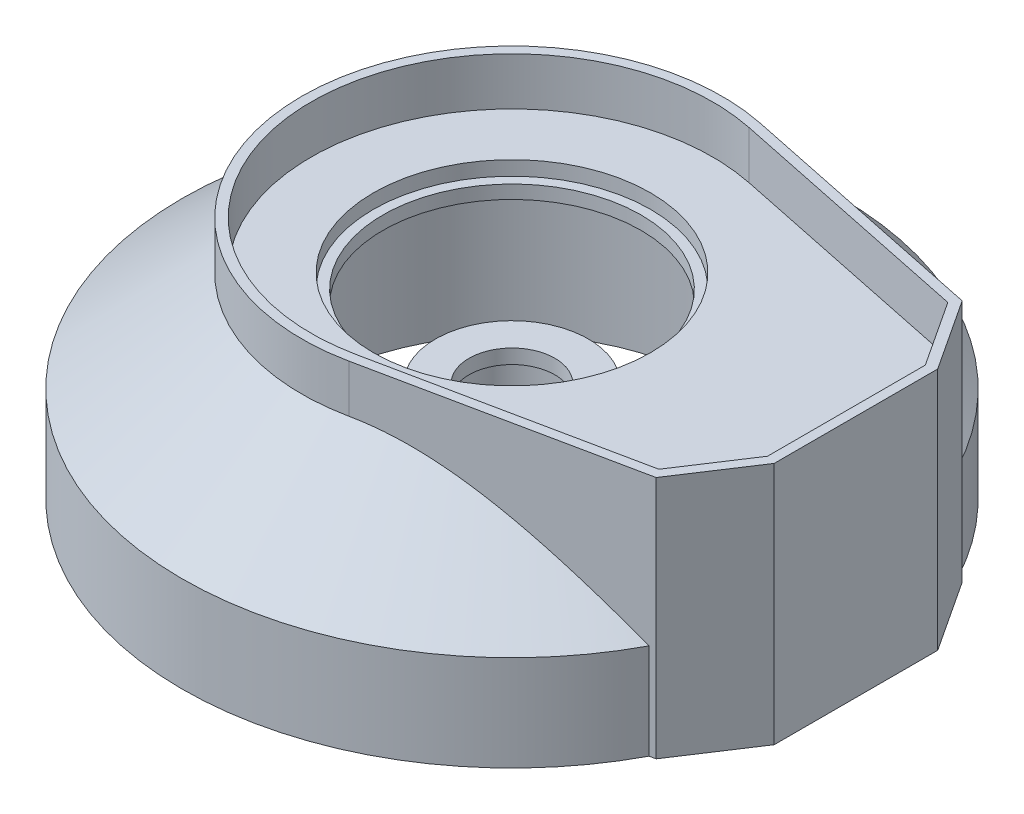
ISO-10303-21;
HEADER;
FILE_DESCRIPTION(('STEP AP214'),'2;1');
FILE_NAME('part.step','',(''),(''),'','','');
FILE_SCHEMA(('AUTOMOTIVE_DESIGN { 1 0 10303 214 1 1 1 1 }'));
ENDSEC;
DATA;
#1=APPLICATION_CONTEXT('core data for automotive mechanical design processes');
#2=APPLICATION_PROTOCOL_DEFINITION('international standard','automotive_design',2000,#1);
#3=PRODUCT_CONTEXT('',#1,'mechanical');
#4=PRODUCT('Part','Part','',(#3));
#5=PRODUCT_RELATED_PRODUCT_CATEGORY('part','',(#4));
#6=PRODUCT_DEFINITION_FORMATION('','',#4);
#7=PRODUCT_DEFINITION_CONTEXT('part definition',#1,'design');
#8=PRODUCT_DEFINITION('design','',#6,#7);
#9=PRODUCT_DEFINITION_SHAPE('','',#8);
#10=(LENGTH_UNIT() NAMED_UNIT(*) SI_UNIT(.MILLI.,.METRE.));
#11=(NAMED_UNIT(*) PLANE_ANGLE_UNIT() SI_UNIT($,.RADIAN.));
#12=(NAMED_UNIT(*) SI_UNIT($,.STERADIAN.) SOLID_ANGLE_UNIT());
#13=UNCERTAINTY_MEASURE_WITH_UNIT(LENGTH_MEASURE(1.E-05),#10,'distance_accuracy_value','');
#14=(GEOMETRIC_REPRESENTATION_CONTEXT(3) GLOBAL_UNCERTAINTY_ASSIGNED_CONTEXT((#13)) GLOBAL_UNIT_ASSIGNED_CONTEXT((#10,
#11,#12)) REPRESENTATION_CONTEXT('',''));
#15=CARTESIAN_POINT('',(0.,0.,0.));
#16=DIRECTION('',(0.,0.,1.));
#17=DIRECTION('',(1.,0.,0.));
#18=AXIS2_PLACEMENT_3D('',#15,#16,#17);
#19=CARTESIAN_POINT('',(0.,-110.40219778561,0.));
#20=DIRECTION('',(0.,1.,0.));
#21=DIRECTION('',(0.,0.,1.));
#22=AXIS2_PLACEMENT_3D('',#19,#20,#21);
#23=CYLINDRICAL_SURFACE('',#22,44.);
#24=CARTESIAN_POINT('',(0.,41.,0.));
#25=DIRECTION('',(0.,-1.,0.));
#26=DIRECTION('',(0.,0.,-1.));
#27=AXIS2_PLACEMENT_3D('',#24,#25,#26);
#28=CIRCLE('',#27,44.);
#29=CARTESIAN_POINT('',(8.93777798271002,41.,43.0826661748294));
#30=VERTEX_POINT('',#29);
#31=CARTESIAN_POINT('',(8.93777798271,41.,-43.0826661748294));
#32=VERTEX_POINT('',#31);
#33=EDGE_CURVE('E265',#30,#32,#28,.T.);
#34=ORIENTED_EDGE('',*,*,#33,.F.);
#35=DIRECTION('',(0.,1.,0.));
#36=VECTOR('',#35,1.);
#37=CARTESIAN_POINT('',(8.93777798271,-110.40219778561,43.0826661748294));
#38=LINE('',#37,#36);
#39=CARTESIAN_POINT('',(8.93777798271,51.,43.0826661748294));
#40=VERTEX_POINT('',#39);
#41=EDGE_CURVE('E408',#30,#40,#38,.T.);
#42=ORIENTED_EDGE('',*,*,#41,.T.);
#43=CARTESIAN_POINT('',(0.,51.,0.));
#44=DIRECTION('',(0.,1.,0.));
#45=DIRECTION('',(0.,0.,1.));
#46=AXIS2_PLACEMENT_3D('',#43,#44,#45);
#47=CIRCLE('',#46,44.);
#48=CARTESIAN_POINT('',(8.93777798271,51.,-43.0826661748294));
#49=VERTEX_POINT('',#48);
#50=EDGE_CURVE('E302',#40,#49,#47,.F.);
#51=ORIENTED_EDGE('',*,*,#50,.T.);
#52=DIRECTION('',(0.,1.,0.));
#53=VECTOR('',#52,1.);
#54=CARTESIAN_POINT('',(8.93777798271,-110.40219778561,-43.0826661748294));
#55=LINE('',#54,#53);
#56=EDGE_CURVE('E410',#32,#49,#55,.T.);
#57=ORIENTED_EDGE('',*,*,#56,.F.);
#58=EDGE_LOOP('',(#34,#42,#51,#57));
#59=FACE_BOUND('',#58,.T.);
#60=ADVANCED_FACE('F121',(#59),#23,.T.);
#61=CARTESIAN_POINT('',(8.93777798271002,-110.40219778561,-43.0826661748294));
#62=DIRECTION('',(-0.203131317788864,0.,0.979151503973394));
#63=DIRECTION('',(0.979151503973394,0.,0.203131317788864));
#64=AXIS2_PLACEMENT_3D('',#61,#62,#63);
#65=PLANE('',#64);
#66=DIRECTION('',(0.,1.,0.));
#67=VECTOR('',#66,1.);
#68=CARTESIAN_POINT('',(60.9803942826881,0.,-32.2860885386865));
#69=LINE('',#68,#67);
#70=CARTESIAN_POINT('',(60.9803942826881,20.,-32.2860885386865));
#71=VERTEX_POINT('',#70);
#72=CARTESIAN_POINT('',(60.9803942826881,0.,-32.2860885386865));
#73=VERTEX_POINT('',#72);
#74=EDGE_CURVE('E137',#71,#73,#69,.F.);
#75=ORIENTED_EDGE('',*,*,#74,.F.);
#76=CARTESIAN_POINT('',(8.93757798271,40.9999999996018,-43.082707666124));
#77=CARTESIAN_POINT('',(9.32519622075362,41.0000059490868,-43.0022937534932));
#78=CARTESIAN_POINT('',(9.71280075916332,40.9955146155934,-42.9218826829402));
#79=CARTESIAN_POINT('',(10.4878066764746,40.9775791489886,-42.7611026885892));
#80=CARTESIAN_POINT('',(10.8752080577615,40.9641351234574,-42.6807337642964));
#81=CARTESIAN_POINT('',(12.036671794259,40.9104450928385,-42.4397805937183));
#82=CARTESIAN_POINT('',(12.8101801104704,40.8568410954801,-42.2793112864098));
#83=CARTESIAN_POINT('',(14.3524813138459,40.7150327815944,-41.9593509180729));
#84=CARTESIAN_POINT('',(15.1212806667881,40.6269007632576,-41.7998585156769));
#85=CARTESIAN_POINT('',(16.6545462287375,40.4174137881808,-41.4817726496437));
#86=CARTESIAN_POINT('',(17.4190122690688,40.2960575471161,-41.3231792209994));
#87=CARTESIAN_POINT('',(18.9310839368563,40.0239526460462,-41.0094901655034));
#88=CARTESIAN_POINT('',(19.6787706114178,39.8736713823153,-40.8543777249051));
#89=CARTESIAN_POINT('',(21.1680592439082,39.5445545454136,-40.5454151575617));
#90=CARTESIAN_POINT('',(21.9096612932241,39.3657194019315,-40.3915650118579));
#91=CARTESIAN_POINT('',(23.3864814446187,38.9815267320164,-40.0851891116294));
#92=CARTESIAN_POINT('',(24.1216974442409,38.7761607996912,-39.9326637932729));
#93=CARTESIAN_POINT('',(25.5851789464068,38.3410906606276,-39.6290550821713));
#94=CARTESIAN_POINT('',(26.3134442160534,38.1113856414615,-39.4779717377421));
#95=CARTESIAN_POINT('',(28.5290726343952,37.3751636284771,-39.018325280047));
#96=CARTESIAN_POINT('',(30.0050673014767,36.8327158286681,-38.7121206318828));
#97=CARTESIAN_POINT('',(32.9278052979048,35.6708589924042,-38.1057797149187));
#98=CARTESIAN_POINT('',(34.3745395754193,35.0514265513548,-37.8056453239799));
#99=CARTESIAN_POINT('',(37.2438754939052,33.7487807213137,-37.2103830137697));
#100=CARTESIAN_POINT('',(38.6664168784914,33.0654296872934,-36.9152675950755));
#101=CARTESIAN_POINT('',(41.4867738479143,31.6481007403202,-36.3301662849013));
#102=CARTESIAN_POINT('',(42.8845919935008,30.914128109623,-36.0401798621772));
#103=CARTESIAN_POINT('',(45.7067297279306,29.3788167969965,-35.454709120775));
#104=CARTESIAN_POINT('',(47.1302881341459,28.5760248230066,-35.1593827143604));
#105=CARTESIAN_POINT('',(49.9575086945688,26.9345421694061,-34.5728575078035));
#106=CARTESIAN_POINT('',(51.361169239332,26.0958486076916,-34.2816590415509));
#107=CARTESIAN_POINT('',(53.4493988324946,24.8183996073651,-33.8484422948233));
#108=CARTESIAN_POINT('',(54.1404884953468,24.3907002699373,-33.7050712706704));
#109=CARTESIAN_POINT('',(55.5187075989268,23.5286848431977,-33.41915079608));
#110=CARTESIAN_POINT('',(56.2058370220628,23.0943687245245,-33.2766013492919));
#111=CARTESIAN_POINT('',(57.5762365710655,22.2198358869676,-32.9923030919165));
#112=CARTESIAN_POINT('',(58.2595076438891,21.7796207141004,-32.8505540848768));
#113=CARTESIAN_POINT('',(59.6226127323629,20.8937010687634,-32.5677691105569));
#114=CARTESIAN_POINT('',(60.302446810579,20.4479966967283,-32.4267331302971));
#115=CARTESIAN_POINT('',(60.9806969321848,19.9998,-32.2860257520893));
#116=B_SPLINE_CURVE_WITH_KNOTS('',3,(#76,#77,#78,#79,#80,#81,#82,#83,#84,#85,#86,#87,#88,#89,
#90,#91,#92,#93,#94,#95,#96,#97,#98,#99,#100,#101,#102,#103,#104,#105,#106,#107,#108,#109,#110,
#111,#112,#113,#114,#115),.UNSPECIFIED.,.F.,.F.,(4,2,2,2,2,2,2,2,2,2,2,2,2,2,2,2,2,2,2,4),(0.,
1.18756155072871,2.37510883133959,4.74963291183058,7.11921132615951,9.48888135250073,
11.8230633755557,14.157210276338,16.492098539503,18.8270647647401,23.6303334864867,
28.4350660693155,33.2503946406428,38.06522150071,43.04696458381,48.0291083435452,
50.5049199642025,52.9807425742829,55.4559285437489,57.9310692923475),.UNSPECIFIED.);
#117=EDGE_CURVE('E268',#32,#71,#116,.T.);
#118=ORIENTED_EDGE('',*,*,#117,.F.);
#119=ORIENTED_EDGE('',*,*,#56,.T.);
#120=DIRECTION('',(0.979151503973394,0.,0.203131317788864));
#121=VECTOR('',#120,1.);
#122=CARTESIAN_POINT('',(8.93777798271,51.,-43.0826661748294));
#123=LINE('',#122,#121);
#124=CARTESIAN_POINT('',(62.208484960266,51.,-32.0313131778886));
#125=VERTEX_POINT('',#124);
#126=EDGE_CURVE('E303',#49,#125,#123,.T.);
#127=ORIENTED_EDGE('',*,*,#126,.T.);
#128=DIRECTION('',(0.,-1.,0.));
#129=VECTOR('',#128,1.);
#130=CARTESIAN_POINT('',(62.208484960266,-110.40219778561,-32.0313131778886));
#131=LINE('',#130,#129);
#132=CARTESIAN_POINT('',(62.208484960266,0.,-32.0313131778886));
#133=VERTEX_POINT('',#132);
#134=EDGE_CURVE('E428',#125,#133,#131,.T.);
#135=ORIENTED_EDGE('',*,*,#134,.T.);
#136=DIRECTION('',(0.979151503973394,0.,0.203131317788864));
#137=VECTOR('',#136,1.);
#138=CARTESIAN_POINT('',(8.93777798271,0.,-43.0826661748294));
#139=LINE('',#138,#137);
#140=EDGE_CURVE('E277',#73,#133,#139,.T.);
#141=ORIENTED_EDGE('',*,*,#140,.F.);
#142=EDGE_LOOP('',(#75,#118,#119,#127,#135,#141));
#143=FACE_BOUND('',#142,.T.);
#144=ADVANCED_FACE('F275',(#143),#65,.F.);
#145=CARTESIAN_POINT('',(8.93777798271002,-110.40219778561,43.0826661748294));
#146=DIRECTION('',(-0.203131317788864,0.,-0.979151503973394));
#147=DIRECTION('',(-0.979151503973394,0.,0.203131317788864));
#148=AXIS2_PLACEMENT_3D('',#145,#146,#147);
#149=PLANE('',#148);
#150=DIRECTION('',(0.,-1.,0.));
#151=VECTOR('',#150,1.);
#152=CARTESIAN_POINT('',(60.9803942826881,0.,32.2860885386865));
#153=LINE('',#152,#151);
#154=CARTESIAN_POINT('',(60.9803942826881,20.,32.2860885386865));
#155=VERTEX_POINT('',#154);
#156=CARTESIAN_POINT('',(60.9803942826881,0.,32.2860885386866));
#157=VERTEX_POINT('',#156);
#158=EDGE_CURVE('E261',#155,#157,#153,.T.);
#159=ORIENTED_EDGE('',*,*,#158,.T.);
#160=DIRECTION('',(-0.979151503973394,0.,0.203131317788864));
#161=VECTOR('',#160,1.);
#162=CARTESIAN_POINT('',(62.208484960266,0.,32.0313131778886));
#163=LINE('',#162,#161);
#164=CARTESIAN_POINT('',(62.208484960266,0.,32.0313131778886));
#165=VERTEX_POINT('',#164);
#166=EDGE_CURVE('E353',#165,#157,#163,.T.);
#167=ORIENTED_EDGE('',*,*,#166,.F.);
#168=DIRECTION('',(0.,1.,0.));
#169=VECTOR('',#168,1.);
#170=CARTESIAN_POINT('',(62.208484960266,-110.40219778561,32.0313131778886));
#171=LINE('',#170,#169);
#172=CARTESIAN_POINT('',(62.208484960266,51.,32.0313131778887));
#173=VERTEX_POINT('',#172);
#174=EDGE_CURVE('E430',#165,#173,#171,.T.);
#175=ORIENTED_EDGE('',*,*,#174,.T.);
#176=DIRECTION('',(-0.979151503973394,0.,0.203131317788864));
#177=VECTOR('',#176,1.);
#178=CARTESIAN_POINT('',(62.208484960266,51.,32.0313131778886));
#179=LINE('',#178,#177);
#180=EDGE_CURVE('E326',#173,#40,#179,.T.);
#181=ORIENTED_EDGE('',*,*,#180,.T.);
#182=ORIENTED_EDGE('',*,*,#41,.F.);
#183=CARTESIAN_POINT('',(8.93757798271,40.9999999996017,43.082707666124));
#184=CARTESIAN_POINT('',(9.32519622075362,41.0000059490868,43.0022937534933));
#185=CARTESIAN_POINT('',(9.71280075916332,40.9955146155934,42.9218826829402));
#186=CARTESIAN_POINT('',(10.4878066764746,40.9775791489886,42.7611026885892));
#187=CARTESIAN_POINT('',(10.8752080577615,40.9641351234574,42.6807337642964));
#188=CARTESIAN_POINT('',(12.036671794259,40.9104450928385,42.4397805937183));
#189=CARTESIAN_POINT('',(12.8101801104704,40.8568410954801,42.2793112864098));
#190=CARTESIAN_POINT('',(14.3524813138459,40.7150327815944,41.9593509180729));
#191=CARTESIAN_POINT('',(15.1212806667881,40.6269007632576,41.7998585156769));
#192=CARTESIAN_POINT('',(16.6545462287375,40.4174137881808,41.4817726496437));
#193=CARTESIAN_POINT('',(17.4190122690688,40.2960575471161,41.3231792209994));
#194=CARTESIAN_POINT('',(18.9310839368563,40.0239526460462,41.0094901655034));
#195=CARTESIAN_POINT('',(19.6787706114178,39.8736713823153,40.8543777249051));
#196=CARTESIAN_POINT('',(21.1680592439082,39.5445545454136,40.5454151575617));
#197=CARTESIAN_POINT('',(21.9096612932241,39.3657194019315,40.3915650118579));
#198=CARTESIAN_POINT('',(23.3864814446187,38.9815267320164,40.0851891116294));
#199=CARTESIAN_POINT('',(24.1216974442409,38.7761607996912,39.932663793273));
#200=CARTESIAN_POINT('',(25.5851789464068,38.3410906606276,39.6290550821713));
#201=CARTESIAN_POINT('',(26.3134442160534,38.1113856414615,39.4779717377421));
#202=CARTESIAN_POINT('',(28.5290726343952,37.3751636284771,39.018325280047));
#203=CARTESIAN_POINT('',(30.0050673014767,36.8327158286681,38.7121206318828));
#204=CARTESIAN_POINT('',(32.9278052979048,35.6708589924042,38.1057797149187));
#205=CARTESIAN_POINT('',(34.3745395754193,35.0514265513548,37.8056453239799));
#206=CARTESIAN_POINT('',(37.2438754939052,33.7487807213137,37.2103830137697));
#207=CARTESIAN_POINT('',(38.6664168784914,33.0654296872934,36.9152675950755));
#208=CARTESIAN_POINT('',(41.4867738479143,31.6481007403202,36.3301662849013));
#209=CARTESIAN_POINT('',(42.8845919935008,30.914128109623,36.0401798621772));
#210=CARTESIAN_POINT('',(45.7067297279305,29.3788167969965,35.454709120775));
#211=CARTESIAN_POINT('',(47.1302881341459,28.5760248230066,35.1593827143604));
#212=CARTESIAN_POINT('',(49.9575086945688,26.9345421694061,34.5728575078035));
#213=CARTESIAN_POINT('',(51.3611692393319,26.0958486076916,34.2816590415509));
#214=CARTESIAN_POINT('',(53.4493988324945,24.8183996073651,33.8484422948233));
#215=CARTESIAN_POINT('',(54.1404884953467,24.3907002699373,33.7050712706705));
#216=CARTESIAN_POINT('',(55.5187075989268,23.5286848431977,33.41915079608));
#217=CARTESIAN_POINT('',(56.2058370220628,23.0943687245245,33.276601349292));
#218=CARTESIAN_POINT('',(57.5762365710655,22.2198358869676,32.9923030919165));
#219=CARTESIAN_POINT('',(58.259507643889,21.7796207141004,32.8505540848768));
#220=CARTESIAN_POINT('',(59.6226127323628,20.8937010687634,32.5677691105569));
#221=CARTESIAN_POINT('',(60.302446810579,20.4479966967283,32.4267331302971));
#222=CARTESIAN_POINT('',(60.9806969321848,19.9998,32.2860257520893));
#223=B_SPLINE_CURVE_WITH_KNOTS('',3,(#183,#184,#185,#186,#187,#188,#189,#190,#191,#192,#193,
#194,#195,#196,#197,#198,#199,#200,#201,#202,#203,#204,#205,#206,#207,#208,#209,#210,#211,#212,
#213,#214,#215,#216,#217,#218,#219,#220,#221,#222),.UNSPECIFIED.,.F.,.F.,(4,2,2,2,2,2,2,2,2,2,2,
2,2,2,2,2,2,2,2,4),(0.,1.18756155072872,2.3751088313396,4.74963291183059,7.11921132615952,
9.48888135250073,11.8230633755557,14.157210276338,16.492098539503,18.8270647647402,
23.6303334864867,28.4350660693155,33.2503946406428,38.06522150071,43.04696458381,
48.0291083435452,50.5049199642025,52.9807425742829,55.4559285437489,57.9310692923475),.UNSPECIFIED.);
#224=EDGE_CURVE('E295',#30,#155,#223,.T.);
#225=ORIENTED_EDGE('',*,*,#224,.T.);
#226=EDGE_LOOP('',(#159,#167,#175,#181,#182,#225));
#227=FACE_BOUND('',#226,.T.);
#228=ADVANCED_FACE('F494',(#227),#149,.F.);
#229=CARTESIAN_POINT('',(-27.,35.2,0.));
#230=DIRECTION('',(0.,-1.,0.));
#231=DIRECTION('',(0.,0.,-1.));
#232=AXIS2_PLACEMENT_3D('',#229,#230,#231);
#233=PLANE('',#232);
#234=CARTESIAN_POINT('',(0.,35.2,0.));
#235=DIRECTION('',(0.,1.,0.));
#236=DIRECTION('',(0.,0.,1.));
#237=AXIS2_PLACEMENT_3D('',#234,#235,#236);
#238=CIRCLE('',#237,27.);
#239=CARTESIAN_POINT('',(0.,35.2,27.));
#240=VERTEX_POINT('',#239);
#241=EDGE_CURVE('E412',#240,#240,#238,.T.);
#242=ORIENTED_EDGE('',*,*,#241,.T.);
#243=EDGE_LOOP('',(#242));
#244=FACE_BOUND('',#243,.T.);
#245=DIRECTION('',(0.979151503973394,0.,-0.203131317788864));
#246=VECTOR('',#245,1.);
#247=CARTESIAN_POINT('',(-17.3544016816684,35.2,46.4945642204433));
#248=LINE('',#247,#246);
#249=CARTESIAN_POINT('',(8.53151534713226,35.2,41.1243631668826));
#250=VERTEX_POINT('',#249);
#251=CARTESIAN_POINT('',(60.9910666595607,35.2,30.2412896634836));
#252=VERTEX_POINT('',#251);
#253=EDGE_CURVE('E406',#250,#252,#248,.T.);
#254=ORIENTED_EDGE('',*,*,#253,.F.);
#255=CARTESIAN_POINT('',(0.,35.2,0.));
#256=DIRECTION('',(0.,-1.,0.));
#257=DIRECTION('',(0.,0.,-1.));
#258=AXIS2_PLACEMENT_3D('',#255,#256,#257);
#259=CIRCLE('',#258,42.);
#260=CARTESIAN_POINT('',(8.53151534713227,35.2,-41.1243631668826));
#261=VERTEX_POINT('',#260);
#262=EDGE_CURVE('E393',#261,#250,#259,.F.);
#263=ORIENTED_EDGE('',*,*,#262,.F.);
#264=DIRECTION('',(-0.979151503973394,0.,-0.203131317788864));
#265=VECTOR('',#264,1.);
#266=CARTESIAN_POINT('',(-17.3544016816684,35.2,-46.4945642204433));
#267=LINE('',#266,#265);
#268=CARTESIAN_POINT('',(60.9910666595607,35.2,-30.2412896634836));
#269=VERTEX_POINT('',#268);
#270=EDGE_CURVE('E396',#269,#261,#267,.T.);
#271=ORIENTED_EDGE('',*,*,#270,.F.);
#272=DIRECTION('',(-0.54872913598873,0.,-0.836000200548458));
#273=VECTOR('',#272,1.);
#274=CARTESIAN_POINT('',(48.3694527184818,35.2,-49.4705798431907));
#275=LINE('',#274,#273);
#276=CARTESIAN_POINT('',(70.,35.2,-16.5159931822528));
#277=VERTEX_POINT('',#276);
#278=EDGE_CURVE('E399',#277,#269,#275,.T.);
#279=ORIENTED_EDGE('',*,*,#278,.F.);
#280=DIRECTION('',(0.,0.,-1.));
#281=VECTOR('',#280,1.);
#282=CARTESIAN_POINT('',(70.,35.2,0.));
#283=LINE('',#282,#281);
#284=CARTESIAN_POINT('',(70.,35.2,16.5159931822528));
#285=VERTEX_POINT('',#284);
#286=EDGE_CURVE('E402',#285,#277,#283,.T.);
#287=ORIENTED_EDGE('',*,*,#286,.F.);
#288=DIRECTION('',(0.54872913598873,0.,-0.836000200548458));
#289=VECTOR('',#288,1.);
#290=CARTESIAN_POINT('',(48.3694527184818,35.2,49.4705798431907));
#291=LINE('',#290,#289);
#292=EDGE_CURVE('E145',#252,#285,#291,.T.);
#293=ORIENTED_EDGE('',*,*,#292,.F.);
#294=EDGE_LOOP('',(#254,#263,#271,#279,#287,#293));
#295=FACE_BOUND('',#294,.T.);
#296=ADVANCED_FACE('F499',(#244,#295),#233,.T.);
#297=CARTESIAN_POINT('',(-32.,41.,0.));
#298=DIRECTION('',(0.,1.,0.));
#299=DIRECTION('',(0.,0.,1.));
#300=AXIS2_PLACEMENT_3D('',#297,#298,#299);
#301=PLANE('',#300);
#302=CARTESIAN_POINT('',(0.,41.,0.));
#303=DIRECTION('',(0.,1.,0.));
#304=DIRECTION('',(0.,0.,1.));
#305=AXIS2_PLACEMENT_3D('',#302,#303,#304);
#306=CIRCLE('',#305,29.);
#307=CARTESIAN_POINT('',(0.,41.,29.));
#308=VERTEX_POINT('',#307);
#309=EDGE_CURVE('E421',#308,#308,#306,.T.);
#310=ORIENTED_EDGE('',*,*,#309,.F.);
#311=EDGE_LOOP('',(#310));
#312=FACE_BOUND('',#311,.T.);
#313=DIRECTION('',(-0.979151503973394,0.,0.203131317788864));
#314=VECTOR('',#313,1.);
#315=CARTESIAN_POINT('',(-22.1480900203352,41.,47.4890458970286));
#316=LINE('',#315,#314);
#317=CARTESIAN_POINT('',(60.9910666595607,41.,30.2412896634836));
#318=VERTEX_POINT('',#317);
#319=CARTESIAN_POINT('',(8.53151534713225,41.,41.1243631668826));
#320=VERTEX_POINT('',#319);
#321=EDGE_CURVE('E14',#318,#320,#316,.T.);
#322=ORIENTED_EDGE('',*,*,#321,.F.);
#323=DIRECTION('',(-0.54872913598873,0.,0.836000200548458));
#324=VECTOR('',#323,1.);
#325=CARTESIAN_POINT('',(46.8639343950671,41.,51.7642681818575));
#326=LINE('',#325,#324);
#327=CARTESIAN_POINT('',(70.,41.,16.5159931822528));
#328=VERTEX_POINT('',#327);
#329=EDGE_CURVE('E130',#328,#318,#326,.T.);
#330=ORIENTED_EDGE('',*,*,#329,.F.);
#331=DIRECTION('',(0.,0.,1.));
#332=VECTOR('',#331,1.);
#333=CARTESIAN_POINT('',(70.,41.,0.));
#334=LINE('',#333,#332);
#335=CARTESIAN_POINT('',(70.,41.,-16.5159931822528));
#336=VERTEX_POINT('',#335);
#337=EDGE_CURVE('E441',#336,#328,#334,.T.);
#338=ORIENTED_EDGE('',*,*,#337,.F.);
#339=DIRECTION('',(0.54872913598873,0.,0.836000200548458));
#340=VECTOR('',#339,1.);
#341=CARTESIAN_POINT('',(46.8639343950671,41.,-51.7642681818575));
#342=LINE('',#341,#340);
#343=CARTESIAN_POINT('',(60.9910666595607,41.,-30.2412896634836));
#344=VERTEX_POINT('',#343);
#345=EDGE_CURVE('E438',#344,#336,#342,.T.);
#346=ORIENTED_EDGE('',*,*,#345,.F.);
#347=DIRECTION('',(0.979151503973394,0.,0.203131317788864));
#348=VECTOR('',#347,1.);
#349=CARTESIAN_POINT('',(-22.1480900203352,41.,-47.4890458970286));
#350=LINE('',#349,#348);
#351=CARTESIAN_POINT('',(8.53151534713227,41.,-41.1243631668826));
#352=VERTEX_POINT('',#351);
#353=EDGE_CURVE('E435',#352,#344,#350,.T.);
#354=ORIENTED_EDGE('',*,*,#353,.F.);
#355=CARTESIAN_POINT('',(0.,41.,0.));
#356=DIRECTION('',(0.,1.,0.));
#357=DIRECTION('',(0.,0.,1.));
#358=AXIS2_PLACEMENT_3D('',#355,#356,#357);
#359=CIRCLE('',#358,42.);
#360=EDGE_CURVE('E432',#320,#352,#359,.F.);
#361=ORIENTED_EDGE('',*,*,#360,.F.);
#362=EDGE_LOOP('',(#322,#330,#338,#346,#354,#361));
#363=FACE_BOUND('',#362,.T.);
#364=ADVANCED_FACE('F462',(#312,#363),#301,.T.);
#365=CARTESIAN_POINT('',(0.,11.5452419351163,0.));
#366=DIRECTION('',(0.,1.,0.));
#367=DIRECTION('',(0.,0.,1.));
#368=AXIS2_PLACEMENT_3D('',#365,#366,#367);
#369=CYLINDRICAL_SURFACE('',#368,29.);
#370=ORIENTED_EDGE('',*,*,#309,.T.);
#371=EDGE_LOOP('',(#370));
#372=FACE_BOUND('',#371,.T.);
#373=CARTESIAN_POINT('',(0.,38.,0.));
#374=DIRECTION('',(0.,1.,0.));
#375=DIRECTION('',(0.,0.,1.));
#376=AXIS2_PLACEMENT_3D('',#373,#374,#375);
#377=CIRCLE('',#376,29.);
#378=CARTESIAN_POINT('',(0.,38.,29.));
#379=VERTEX_POINT('',#378);
#380=EDGE_CURVE('E418',#379,#379,#377,.T.);
#381=ORIENTED_EDGE('',*,*,#380,.F.);
#382=EDGE_LOOP('',(#381));
#383=FACE_BOUND('',#382,.T.);
#384=ADVANCED_FACE('F507',(#372,#383),#369,.F.);
#385=CARTESIAN_POINT('',(-29.,38.,0.));
#386=DIRECTION('',(0.,1.,0.));
#387=DIRECTION('',(0.,0.,1.));
#388=AXIS2_PLACEMENT_3D('',#385,#386,#387);
#389=PLANE('',#388);
#390=ORIENTED_EDGE('',*,*,#380,.T.);
#391=EDGE_LOOP('',(#390));
#392=FACE_BOUND('',#391,.T.);
#393=CARTESIAN_POINT('',(0.,38.,0.));
#394=DIRECTION('',(0.,1.,0.));
#395=DIRECTION('',(0.,0.,1.));
#396=AXIS2_PLACEMENT_3D('',#393,#394,#395);
#397=CIRCLE('',#396,27.);
#398=CARTESIAN_POINT('',(0.,38.,27.));
#399=VERTEX_POINT('',#398);
#400=EDGE_CURVE('E415',#399,#399,#397,.T.);
#401=ORIENTED_EDGE('',*,*,#400,.F.);
#402=EDGE_LOOP('',(#401));
#403=FACE_BOUND('',#402,.T.);
#404=ADVANCED_FACE('F503',(#392,#403),#389,.T.);
#405=CARTESIAN_POINT('',(0.,11.5452419351163,0.));
#406=DIRECTION('',(0.,1.,0.));
#407=DIRECTION('',(0.,0.,1.));
#408=AXIS2_PLACEMENT_3D('',#405,#406,#407);
#409=CYLINDRICAL_SURFACE('',#408,27.);
#410=ORIENTED_EDGE('',*,*,#400,.T.);
#411=EDGE_LOOP('',(#410));
#412=FACE_BOUND('',#411,.T.);
#413=ORIENTED_EDGE('',*,*,#241,.F.);
#414=EDGE_LOOP('',(#413));
#415=FACE_BOUND('',#414,.T.);
#416=ADVANCED_FACE('F481',(#412,#415),#409,.F.);
#417=CARTESIAN_POINT('',(-32.,51.,0.));
#418=DIRECTION('',(0.,1.,0.));
#419=DIRECTION('',(0.,0.,1.));
#420=AXIS2_PLACEMENT_3D('',#417,#418,#419);
#421=PLANE('',#420);
#422=ORIENTED_EDGE('',*,*,#50,.F.);
#423=ORIENTED_EDGE('',*,*,#180,.F.);
#424=DIRECTION('',(-0.54872913598873,0.,0.836000200548458));
#425=VECTOR('',#424,1.);
#426=CARTESIAN_POINT('',(72.,51.,17.113737273811));
#427=LINE('',#426,#425);
#428=CARTESIAN_POINT('',(72.,51.,17.113737273811));
#429=VERTEX_POINT('',#428);
#430=EDGE_CURVE('E329',#429,#173,#427,.T.);
#431=ORIENTED_EDGE('',*,*,#430,.F.);
#432=DIRECTION('',(0.,0.,1.));
#433=VECTOR('',#432,1.);
#434=CARTESIAN_POINT('',(72.,51.,-17.113737273811));
#435=LINE('',#434,#433);
#436=CARTESIAN_POINT('',(72.,51.,-17.113737273811));
#437=VERTEX_POINT('',#436);
#438=EDGE_CURVE('E332',#437,#429,#435,.T.);
#439=ORIENTED_EDGE('',*,*,#438,.F.);
#440=DIRECTION('',(0.54872913598873,0.,0.836000200548458));
#441=VECTOR('',#440,1.);
#442=CARTESIAN_POINT('',(62.208484960266,51.,-32.0313131778886));
#443=LINE('',#442,#441);
#444=EDGE_CURVE('E307',#125,#437,#443,.T.);
#445=ORIENTED_EDGE('',*,*,#444,.F.);
#446=ORIENTED_EDGE('',*,*,#126,.F.);
#447=EDGE_LOOP('',(#422,#423,#431,#439,#445,#446));
#448=FACE_BOUND('',#447,.T.);
#449=DIRECTION('',(-0.979151503973394,0.,0.203131317788864));
#450=VECTOR('',#449,1.);
#451=CARTESIAN_POINT('',(61.8022223246883,51.,30.0730101699419));
#452=LINE('',#451,#450);
#453=CARTESIAN_POINT('',(60.9910666595607,51.,30.2412896634836));
#454=VERTEX_POINT('',#453);
#455=CARTESIAN_POINT('',(8.53151534713226,51.,41.1243631668826));
#456=VERTEX_POINT('',#455);
#457=EDGE_CURVE('E306',#454,#456,#452,.T.);
#458=ORIENTED_EDGE('',*,*,#457,.T.);
#459=CARTESIAN_POINT('',(0.,51.,0.));
#460=DIRECTION('',(0.,1.,0.));
#461=DIRECTION('',(0.,0.,1.));
#462=AXIS2_PLACEMENT_3D('',#459,#460,#461);
#463=CIRCLE('',#462,42.);
#464=CARTESIAN_POINT('',(8.53151534713227,51.,-41.1243631668826));
#465=VERTEX_POINT('',#464);
#466=EDGE_CURVE('E308',#456,#465,#463,.F.);
#467=ORIENTED_EDGE('',*,*,#466,.T.);
#468=DIRECTION('',(0.979151503973394,0.,0.203131317788864));
#469=VECTOR('',#468,1.);
#470=CARTESIAN_POINT('',(8.53151534713227,51.,-41.1243631668826));
#471=LINE('',#470,#469);
#472=CARTESIAN_POINT('',(60.9910666595607,51.,-30.2412896634836));
#473=VERTEX_POINT('',#472);
#474=EDGE_CURVE('E311',#465,#473,#471,.T.);
#475=ORIENTED_EDGE('',*,*,#474,.T.);
#476=DIRECTION('',(0.54872913598873,0.,0.836000200548458));
#477=VECTOR('',#476,1.);
#478=CARTESIAN_POINT('',(60.5364845591691,51.,-30.9338549059112));
#479=LINE('',#478,#477);
#480=CARTESIAN_POINT('',(70.,51.,-16.5159931822528));
#481=VERTEX_POINT('',#480);
#482=EDGE_CURVE('E321',#473,#481,#479,.T.);
#483=ORIENTED_EDGE('',*,*,#482,.T.);
#484=DIRECTION('',(0.,0.,1.));
#485=VECTOR('',#484,1.);
#486=CARTESIAN_POINT('',(70.,51.,-17.113737273811));
#487=LINE('',#486,#485);
#488=CARTESIAN_POINT('',(70.,51.,16.5159931822528));
#489=VERTEX_POINT('',#488);
#490=EDGE_CURVE('E318',#481,#489,#487,.T.);
#491=ORIENTED_EDGE('',*,*,#490,.T.);
#492=DIRECTION('',(-0.54872913598873,0.,0.836000200548458));
#493=VECTOR('',#492,1.);
#494=CARTESIAN_POINT('',(70.3279995989031,51.,16.0162790018335));
#495=LINE('',#494,#493);
#496=EDGE_CURVE('E314',#489,#454,#495,.T.);
#497=ORIENTED_EDGE('',*,*,#496,.T.);
#498=EDGE_LOOP('',(#458,#467,#475,#483,#491,#497));
#499=FACE_BOUND('',#498,.T.);
#500=ADVANCED_FACE('F456',(#448,#499),#421,.T.);
#501=CARTESIAN_POINT('',(0.,-145.60219778561,0.));
#502=DIRECTION('',(0.,1.,0.));
#503=DIRECTION('',(0.,0.,1.));
#504=AXIS2_PLACEMENT_3D('',#501,#502,#503);
#505=CYLINDRICAL_SURFACE('',#504,42.);
#506=DIRECTION('',(0.,1.,0.));
#507=VECTOR('',#506,1.);
#508=CARTESIAN_POINT('',(8.53151534713226,-145.60219778561,41.1243631668826));
#509=LINE('',#508,#507);
#510=EDGE_CURVE('E366',#320,#456,#509,.T.);
#511=ORIENTED_EDGE('',*,*,#510,.F.);
#512=ORIENTED_EDGE('',*,*,#360,.T.);
#513=DIRECTION('',(0.,1.,0.));
#514=VECTOR('',#513,1.);
#515=CARTESIAN_POINT('',(8.53151534713227,-145.60219778561,-41.1243631668826));
#516=LINE('',#515,#514);
#517=EDGE_CURVE('E386',#352,#465,#516,.T.);
#518=ORIENTED_EDGE('',*,*,#517,.T.);
#519=ORIENTED_EDGE('',*,*,#466,.F.);
#520=EDGE_LOOP('',(#511,#512,#518,#519));
#521=FACE_BOUND('',#520,.T.);
#522=ADVANCED_FACE('F471',(#521),#505,.F.);
#523=CARTESIAN_POINT('',(8.53151534713227,-145.60219778561,-41.1243631668826));
#524=DIRECTION('',(-0.203131317788864,0.,0.979151503973394));
#525=DIRECTION('',(0.979151503973394,0.,0.203131317788864));
#526=AXIS2_PLACEMENT_3D('',#523,#524,#525);
#527=PLANE('',#526);
#528=ORIENTED_EDGE('',*,*,#517,.F.);
#529=ORIENTED_EDGE('',*,*,#353,.T.);
#530=DIRECTION('',(0.,1.,0.));
#531=VECTOR('',#530,1.);
#532=CARTESIAN_POINT('',(60.9910666595607,-145.60219778561,-30.2412896634836));
#533=LINE('',#532,#531);
#534=EDGE_CURVE('E382',#344,#473,#533,.T.);
#535=ORIENTED_EDGE('',*,*,#534,.T.);
#536=ORIENTED_EDGE('',*,*,#474,.F.);
#537=EDGE_LOOP('',(#528,#529,#535,#536));
#538=FACE_BOUND('',#537,.T.);
#539=ADVANCED_FACE('F469',(#538),#527,.T.);
#540=CARTESIAN_POINT('',(60.5364845591691,-145.60219778561,-30.9338549059112));
#541=DIRECTION('',(-0.836000200548458,0.,0.54872913598873));
#542=DIRECTION('',(0.54872913598873,0.,0.836000200548458));
#543=AXIS2_PLACEMENT_3D('',#540,#541,#542);
#544=PLANE('',#543);
#545=ORIENTED_EDGE('',*,*,#534,.F.);
#546=ORIENTED_EDGE('',*,*,#345,.T.);
#547=DIRECTION('',(0.,1.,0.));
#548=VECTOR('',#547,1.);
#549=CARTESIAN_POINT('',(70.,-145.60219778561,-16.5159931822528));
#550=LINE('',#549,#548);
#551=EDGE_CURVE('E378',#336,#481,#550,.T.);
#552=ORIENTED_EDGE('',*,*,#551,.T.);
#553=ORIENTED_EDGE('',*,*,#482,.F.);
#554=EDGE_LOOP('',(#545,#546,#552,#553));
#555=FACE_BOUND('',#554,.T.);
#556=ADVANCED_FACE('F465',(#555),#544,.T.);
#557=CARTESIAN_POINT('',(70.,-145.60219778561,-17.113737273811));
#558=DIRECTION('',(-1.,0.,0.));
#559=DIRECTION('',(0.,0.,1.));
#560=AXIS2_PLACEMENT_3D('',#557,#558,#559);
#561=PLANE('',#560);
#562=ORIENTED_EDGE('',*,*,#551,.F.);
#563=ORIENTED_EDGE('',*,*,#337,.T.);
#564=DIRECTION('',(0.,1.,0.));
#565=VECTOR('',#564,1.);
#566=CARTESIAN_POINT('',(70.,-145.60219778561,16.5159931822528));
#567=LINE('',#566,#565);
#568=EDGE_CURVE('E374',#328,#489,#567,.T.);
#569=ORIENTED_EDGE('',*,*,#568,.T.);
#570=ORIENTED_EDGE('',*,*,#490,.F.);
#571=EDGE_LOOP('',(#562,#563,#569,#570));
#572=FACE_BOUND('',#571,.T.);
#573=ADVANCED_FACE('F461',(#572),#561,.T.);
#574=CARTESIAN_POINT('',(70.3279995989031,-145.60219778561,16.0162790018335));
#575=DIRECTION('',(-0.836000200548458,0.,-0.54872913598873));
#576=DIRECTION('',(-0.54872913598873,0.,0.836000200548458));
#577=AXIS2_PLACEMENT_3D('',#574,#575,#576);
#578=PLANE('',#577);
#579=ORIENTED_EDGE('',*,*,#568,.F.);
#580=ORIENTED_EDGE('',*,*,#329,.T.);
#581=DIRECTION('',(0.,1.,0.));
#582=VECTOR('',#581,1.);
#583=CARTESIAN_POINT('',(60.9910666595607,-145.60219778561,30.2412896634836));
#584=LINE('',#583,#582);
#585=EDGE_CURVE('E370',#318,#454,#584,.T.);
#586=ORIENTED_EDGE('',*,*,#585,.T.);
#587=ORIENTED_EDGE('',*,*,#496,.F.);
#588=EDGE_LOOP('',(#579,#580,#586,#587));
#589=FACE_BOUND('',#588,.T.);
#590=ADVANCED_FACE('F447',(#589),#578,.T.);
#591=CARTESIAN_POINT('',(61.8022223246883,-145.60219778561,30.0730101699419));
#592=DIRECTION('',(-0.203131317788864,0.,-0.979151503973394));
#593=DIRECTION('',(-0.979151503973394,0.,0.203131317788864));
#594=AXIS2_PLACEMENT_3D('',#591,#592,#593);
#595=PLANE('',#594);
#596=ORIENTED_EDGE('',*,*,#585,.F.);
#597=ORIENTED_EDGE('',*,*,#321,.T.);
#598=ORIENTED_EDGE('',*,*,#510,.T.);
#599=ORIENTED_EDGE('',*,*,#457,.F.);
#600=EDGE_LOOP('',(#596,#597,#598,#599));
#601=FACE_BOUND('',#600,.T.);
#602=ADVANCED_FACE('F452',(#601),#595,.T.);
#603=CARTESIAN_POINT('',(72.,-110.40219778561,-17.113737273811));
#604=DIRECTION('',(-0.836000200548458,0.,0.54872913598873));
#605=DIRECTION('',(0.,1.,0.));
#606=AXIS2_PLACEMENT_3D('',#603,#604,#605);
#607=PLANE('',#606);
#608=DIRECTION('',(0.,1.,0.));
#609=VECTOR('',#608,1.);
#610=CARTESIAN_POINT('',(72.,-110.40219778561,-17.113737273811));
#611=LINE('',#610,#609);
#612=CARTESIAN_POINT('',(72.,0.,-17.113737273811));
#613=VERTEX_POINT('',#612);
#614=EDGE_CURVE('E426',#613,#437,#611,.T.);
#615=ORIENTED_EDGE('',*,*,#614,.F.);
#616=DIRECTION('',(0.54872913598873,0.,0.836000200548458));
#617=VECTOR('',#616,1.);
#618=CARTESIAN_POINT('',(62.208484960266,0.,-32.0313131778886));
#619=LINE('',#618,#617);
#620=EDGE_CURVE('E362',#133,#613,#619,.T.);
#621=ORIENTED_EDGE('',*,*,#620,.F.);
#622=ORIENTED_EDGE('',*,*,#134,.F.);
#623=ORIENTED_EDGE('',*,*,#444,.T.);
#624=EDGE_LOOP('',(#615,#621,#622,#623));
#625=FACE_BOUND('',#624,.T.);
#626=ADVANCED_FACE('F518',(#625),#607,.F.);
#627=CARTESIAN_POINT('',(72.,-110.40219778561,0.));
#628=DIRECTION('',(-1.,0.,0.));
#629=DIRECTION('',(0.,0.,1.));
#630=AXIS2_PLACEMENT_3D('',#627,#628,#629);
#631=PLANE('',#630);
#632=DIRECTION('',(0.,-1.,0.));
#633=VECTOR('',#632,1.);
#634=CARTESIAN_POINT('',(72.,-110.40219778561,17.113737273811));
#635=LINE('',#634,#633);
#636=CARTESIAN_POINT('',(72.,0.,17.113737273811));
#637=VERTEX_POINT('',#636);
#638=EDGE_CURVE('E424',#429,#637,#635,.T.);
#639=ORIENTED_EDGE('',*,*,#638,.T.);
#640=DIRECTION('',(0.,0.,1.));
#641=VECTOR('',#640,1.);
#642=CARTESIAN_POINT('',(72.,0.,-17.113737273811));
#643=LINE('',#642,#641);
#644=EDGE_CURVE('E359',#613,#637,#643,.T.);
#645=ORIENTED_EDGE('',*,*,#644,.F.);
#646=ORIENTED_EDGE('',*,*,#614,.T.);
#647=ORIENTED_EDGE('',*,*,#438,.T.);
#648=EDGE_LOOP('',(#639,#645,#646,#647));
#649=FACE_BOUND('',#648,.T.);
#650=ADVANCED_FACE('F522',(#649),#631,.F.);
#651=CARTESIAN_POINT('',(62.208484960266,-110.40219778561,32.0313131778886));
#652=DIRECTION('',(-0.836000200548458,0.,-0.54872913598873));
#653=DIRECTION('',(0.,1.,0.));
#654=AXIS2_PLACEMENT_3D('',#651,#652,#653);
#655=PLANE('',#654);
#656=ORIENTED_EDGE('',*,*,#174,.F.);
#657=DIRECTION('',(-0.54872913598873,0.,0.836000200548458));
#658=VECTOR('',#657,1.);
#659=CARTESIAN_POINT('',(72.,0.,17.113737273811));
#660=LINE('',#659,#658);
#661=EDGE_CURVE('E356',#637,#165,#660,.T.);
#662=ORIENTED_EDGE('',*,*,#661,.F.);
#663=ORIENTED_EDGE('',*,*,#638,.F.);
#664=ORIENTED_EDGE('',*,*,#430,.T.);
#665=EDGE_LOOP('',(#656,#662,#663,#664));
#666=FACE_BOUND('',#665,.T.);
#667=ADVANCED_FACE('F124',(#666),#655,.F.);
#668=CARTESIAN_POINT('',(8.53151534713226,0.,41.1243631668826));
#669=VERTEX_POINT('',#668);
#670=EDGE_CURVE('E367',#669,#250,#509,.T.);
#671=ORIENTED_EDGE('',*,*,#670,.T.);
#672=ORIENTED_EDGE('',*,*,#253,.T.);
#673=CARTESIAN_POINT('',(60.9910666595607,0.,30.2412896634836));
#674=VERTEX_POINT('',#673);
#675=EDGE_CURVE('E371',#674,#252,#584,.T.);
#676=ORIENTED_EDGE('',*,*,#675,.F.);
#677=DIRECTION('',(-0.979151503973394,0.,0.203131317788864));
#678=VECTOR('',#677,1.);
#679=CARTESIAN_POINT('',(61.8022223246883,0.,30.0730101699419));
#680=LINE('',#679,#678);
#681=EDGE_CURVE('E390',#674,#669,#680,.T.);
#682=ORIENTED_EDGE('',*,*,#681,.T.);
#683=EDGE_LOOP('',(#671,#672,#676,#682));
#684=FACE_BOUND('',#683,.T.);
#685=ADVANCED_FACE('F530',(#684),#595,.T.);
#686=ORIENTED_EDGE('',*,*,#675,.T.);
#687=ORIENTED_EDGE('',*,*,#292,.T.);
#688=CARTESIAN_POINT('',(70.,0.,16.5159931822528));
#689=VERTEX_POINT('',#688);
#690=EDGE_CURVE('E375',#689,#285,#567,.T.);
#691=ORIENTED_EDGE('',*,*,#690,.F.);
#692=DIRECTION('',(-0.54872913598873,0.,0.836000200548458));
#693=VECTOR('',#692,1.);
#694=CARTESIAN_POINT('',(70.3279995989031,0.,16.0162790018335));
#695=LINE('',#694,#693);
#696=EDGE_CURVE('E317',#689,#674,#695,.T.);
#697=ORIENTED_EDGE('',*,*,#696,.T.);
#698=EDGE_LOOP('',(#686,#687,#691,#697));
#699=FACE_BOUND('',#698,.T.);
#700=ADVANCED_FACE('F548',(#699),#578,.T.);
#701=ORIENTED_EDGE('',*,*,#690,.T.);
#702=ORIENTED_EDGE('',*,*,#286,.T.);
#703=CARTESIAN_POINT('',(70.,0.,-16.5159931822528));
#704=VERTEX_POINT('',#703);
#705=EDGE_CURVE('E379',#704,#277,#550,.T.);
#706=ORIENTED_EDGE('',*,*,#705,.F.);
#707=DIRECTION('',(0.,0.,1.));
#708=VECTOR('',#707,1.);
#709=CARTESIAN_POINT('',(70.,0.,-17.113737273811));
#710=LINE('',#709,#708);
#711=EDGE_CURVE('E341',#704,#689,#710,.T.);
#712=ORIENTED_EDGE('',*,*,#711,.T.);
#713=EDGE_LOOP('',(#701,#702,#706,#712));
#714=FACE_BOUND('',#713,.T.);
#715=ADVANCED_FACE('F553',(#714),#561,.T.);
#716=ORIENTED_EDGE('',*,*,#705,.T.);
#717=ORIENTED_EDGE('',*,*,#278,.T.);
#718=CARTESIAN_POINT('',(60.9910666595607,0.,-30.2412896634836));
#719=VERTEX_POINT('',#718);
#720=EDGE_CURVE('E383',#719,#269,#533,.T.);
#721=ORIENTED_EDGE('',*,*,#720,.F.);
#722=DIRECTION('',(0.54872913598873,0.,0.836000200548458));
#723=VECTOR('',#722,1.);
#724=CARTESIAN_POINT('',(60.5364845591691,0.,-30.9338549059112));
#725=LINE('',#724,#723);
#726=EDGE_CURVE('E344',#719,#704,#725,.T.);
#727=ORIENTED_EDGE('',*,*,#726,.T.);
#728=EDGE_LOOP('',(#716,#717,#721,#727));
#729=FACE_BOUND('',#728,.T.);
#730=ADVANCED_FACE('F562',(#729),#544,.T.);
#731=ORIENTED_EDGE('',*,*,#720,.T.);
#732=ORIENTED_EDGE('',*,*,#270,.T.);
#733=CARTESIAN_POINT('',(8.53151534713227,0.,-41.1243631668826));
#734=VERTEX_POINT('',#733);
#735=EDGE_CURVE('E387',#734,#261,#516,.T.);
#736=ORIENTED_EDGE('',*,*,#735,.F.);
#737=DIRECTION('',(0.979151503973394,0.,0.203131317788864));
#738=VECTOR('',#737,1.);
#739=CARTESIAN_POINT('',(8.53151534713227,0.,-41.1243631668826));
#740=LINE('',#739,#738);
#741=EDGE_CURVE('E347',#734,#719,#740,.T.);
#742=ORIENTED_EDGE('',*,*,#741,.T.);
#743=EDGE_LOOP('',(#731,#732,#736,#742));
#744=FACE_BOUND('',#743,.T.);
#745=ADVANCED_FACE('F480',(#744),#527,.T.);
#746=ORIENTED_EDGE('',*,*,#735,.T.);
#747=ORIENTED_EDGE('',*,*,#262,.T.);
#748=ORIENTED_EDGE('',*,*,#670,.F.);
#749=CARTESIAN_POINT('',(0.,0.,0.));
#750=DIRECTION('',(0.,-1.,0.));
#751=DIRECTION('',(0.,0.,-1.));
#752=AXIS2_PLACEMENT_3D('',#749,#750,#751);
#753=CIRCLE('',#752,42.);
#754=EDGE_CURVE('E350',#669,#734,#753,.T.);
#755=ORIENTED_EDGE('',*,*,#754,.T.);
#756=EDGE_LOOP('',(#746,#747,#748,#755));
#757=FACE_BOUND('',#756,.T.);
#758=ADVANCED_FACE('F474',(#757),#505,.F.);
#759=CARTESIAN_POINT('',(-13.,0.,0.));
#760=DIRECTION('',(0.,-1.,0.));
#761=DIRECTION('',(0.,0.,-1.));
#762=AXIS2_PLACEMENT_3D('',#759,#760,#761);
#763=PLANE('',#762);
#764=ORIENTED_EDGE('',*,*,#754,.F.);
#765=ORIENTED_EDGE('',*,*,#681,.F.);
#766=ORIENTED_EDGE('',*,*,#696,.F.);
#767=ORIENTED_EDGE('',*,*,#711,.F.);
#768=ORIENTED_EDGE('',*,*,#726,.F.);
#769=ORIENTED_EDGE('',*,*,#741,.F.);
#770=EDGE_LOOP('',(#764,#765,#766,#767,#768,#769));
#771=FACE_BOUND('',#770,.T.);
#772=ORIENTED_EDGE('',*,*,#166,.T.);
#773=CARTESIAN_POINT('',(0.,0.,0.));
#774=DIRECTION('',(0.,-1.,0.));
#775=DIRECTION('',(0.,0.,-1.));
#776=AXIS2_PLACEMENT_3D('',#773,#774,#775);
#777=CIRCLE('',#776,69.);
#778=EDGE_CURVE('E264',#157,#73,#777,.T.);
#779=ORIENTED_EDGE('',*,*,#778,.T.);
#780=ORIENTED_EDGE('',*,*,#140,.T.);
#781=ORIENTED_EDGE('',*,*,#620,.T.);
#782=ORIENTED_EDGE('',*,*,#644,.T.);
#783=ORIENTED_EDGE('',*,*,#661,.T.);
#784=EDGE_LOOP('',(#772,#779,#780,#781,#782,#783));
#785=FACE_BOUND('',#784,.T.);
#786=ADVANCED_FACE('F486',(#771,#785),#763,.T.);
#787=CARTESIAN_POINT('',(0.,0.,0.));
#788=DIRECTION('',(0.,-1.,0.));
#789=DIRECTION('',(0.,0.,-1.));
#790=AXIS2_PLACEMENT_3D('',#787,#788,#789);
#791=CYLINDRICAL_SURFACE('',#790,69.);
#792=ORIENTED_EDGE('',*,*,#158,.F.);
#793=CARTESIAN_POINT('',(0.,20.,0.));
#794=DIRECTION('',(0.,-1.,0.));
#795=DIRECTION('',(0.,0.,-1.));
#796=AXIS2_PLACEMENT_3D('',#793,#794,#795);
#797=CIRCLE('',#796,69.);
#798=EDGE_CURVE('E257',#155,#71,#797,.T.);
#799=ORIENTED_EDGE('',*,*,#798,.T.);
#800=ORIENTED_EDGE('',*,*,#74,.T.);
#801=ORIENTED_EDGE('',*,*,#778,.F.);
#802=EDGE_LOOP('',(#792,#799,#800,#801));
#803=FACE_BOUND('',#802,.T.);
#804=ADVANCED_FACE('F259',(#803),#791,.T.);
#805=CARTESIAN_POINT('',(0.,41.,0.));
#806=DIRECTION('',(0.,-1.,0.));
#807=DIRECTION('',(0.,0.,-1.));
#808=AXIS2_PLACEMENT_3D('',#805,#806,#807);
#809=CONICAL_SURFACE('',#808,44.,0.872136502073433);
#810=ORIENTED_EDGE('',*,*,#224,.F.);
#811=ORIENTED_EDGE('',*,*,#33,.T.);
#812=ORIENTED_EDGE('',*,*,#117,.T.);
#813=ORIENTED_EDGE('',*,*,#798,.F.);
#814=EDGE_LOOP('',(#810,#811,#812,#813));
#815=FACE_BOUND('',#814,.T.);
#816=ADVANCED_FACE('F269',(#815),#809,.T.);
#817=CLOSED_SHELL('',(#60,#144,#228,#296,#364,#384,#404,#416,#500,#522,#539,#556,#573,#590,#602,
#626,#650,#667,#685,#700,#715,#730,#745,#758,#786,#804,#816));
#818=MANIFOLD_SOLID_BREP('B2',#817);
#819=CARTESIAN_POINT('',(0.,11.5452419351163,0.));
#820=DIRECTION('',(0.,1.,0.));
#821=DIRECTION('',(0.,0.,1.));
#822=AXIS2_PLACEMENT_3D('',#819,#820,#821);
#823=CYLINDRICAL_SURFACE('',#822,16.);
#824=CARTESIAN_POINT('',(0.,0.,0.));
#825=DIRECTION('',(0.,1.,0.));
#826=DIRECTION('',(0.,0.,1.));
#827=AXIS2_PLACEMENT_3D('',#824,#825,#826);
#828=CIRCLE('',#827,16.);
#829=CARTESIAN_POINT('',(0.,0.,16.));
#830=VERTEX_POINT('',#829);
#831=EDGE_CURVE('E798',#830,#830,#828,.T.);
#832=ORIENTED_EDGE('',*,*,#831,.T.);
#833=EDGE_LOOP('',(#832));
#834=FACE_BOUND('',#833,.T.);
#835=CARTESIAN_POINT('',(0.,21.,0.));
#836=DIRECTION('',(0.,1.,0.));
#837=DIRECTION('',(0.,0.,1.));
#838=AXIS2_PLACEMENT_3D('',#835,#836,#837);
#839=CIRCLE('',#838,16.);
#840=CARTESIAN_POINT('',(0.,21.,16.));
#841=VERTEX_POINT('',#840);
#842=EDGE_CURVE('E120',#841,#841,#839,.T.);
#843=ORIENTED_EDGE('',*,*,#842,.F.);
#844=EDGE_LOOP('',(#843));
#845=FACE_BOUND('',#844,.T.);
#846=ADVANCED_FACE('F770',(#834,#845),#823,.T.);
#847=CARTESIAN_POINT('',(-16.,21.,0.));
#848=DIRECTION('',(0.,1.,0.));
#849=DIRECTION('',(0.,0.,1.));
#850=AXIS2_PLACEMENT_3D('',#847,#848,#849);
#851=PLANE('',#850);
#852=ORIENTED_EDGE('',*,*,#842,.T.);
#853=EDGE_LOOP('',(#852));
#854=FACE_BOUND('',#853,.T.);
#855=CARTESIAN_POINT('',(0.,21.,0.));
#856=DIRECTION('',(0.,1.,0.));
#857=DIRECTION('',(0.,0.,1.));
#858=AXIS2_PLACEMENT_3D('',#855,#856,#857);
#859=CIRCLE('',#858,9.);
#860=CARTESIAN_POINT('',(0.,21.,9.));
#861=VERTEX_POINT('',#860);
#862=EDGE_CURVE('E776',#861,#861,#859,.T.);
#863=ORIENTED_EDGE('',*,*,#862,.F.);
#864=EDGE_LOOP('',(#863));
#865=FACE_BOUND('',#864,.T.);
#866=ADVANCED_FACE('F816',(#854,#865),#851,.T.);
#867=CARTESIAN_POINT('',(0.,11.5452419351163,0.));
#868=DIRECTION('',(0.,1.,0.));
#869=DIRECTION('',(0.,0.,1.));
#870=AXIS2_PLACEMENT_3D('',#867,#868,#869);
#871=CYLINDRICAL_SURFACE('',#870,9.);
#872=ORIENTED_EDGE('',*,*,#862,.T.);
#873=EDGE_LOOP('',(#872));
#874=FACE_BOUND('',#873,.T.);
#875=CARTESIAN_POINT('',(0.,18.,0.));
#876=DIRECTION('',(0.,1.,0.));
#877=DIRECTION('',(0.,0.,1.));
#878=AXIS2_PLACEMENT_3D('',#875,#876,#877);
#879=CIRCLE('',#878,9.);
#880=CARTESIAN_POINT('',(0.,18.,9.));
#881=VERTEX_POINT('',#880);
#882=EDGE_CURVE('E780',#881,#881,#879,.T.);
#883=ORIENTED_EDGE('',*,*,#882,.F.);
#884=EDGE_LOOP('',(#883));
#885=FACE_BOUND('',#884,.T.);
#886=ADVANCED_FACE('F820',(#874,#885),#871,.F.);
#887=CARTESIAN_POINT('',(-9.,18.,0.));
#888=DIRECTION('',(0.,-1.,0.));
#889=DIRECTION('',(0.,0.,-1.));
#890=AXIS2_PLACEMENT_3D('',#887,#888,#889);
#891=PLANE('',#890);
#892=ORIENTED_EDGE('',*,*,#882,.T.);
#893=EDGE_LOOP('',(#892));
#894=FACE_BOUND('',#893,.T.);
#895=CARTESIAN_POINT('',(0.,18.,0.));
#896=DIRECTION('',(0.,1.,0.));
#897=DIRECTION('',(0.,0.,1.));
#898=AXIS2_PLACEMENT_3D('',#895,#896,#897);
#899=CIRCLE('',#898,11.);
#900=CARTESIAN_POINT('',(0.,18.,11.));
#901=VERTEX_POINT('',#900);
#902=EDGE_CURVE('E784',#901,#901,#899,.T.);
#903=ORIENTED_EDGE('',*,*,#902,.F.);
#904=EDGE_LOOP('',(#903));
#905=FACE_BOUND('',#904,.T.);
#906=ADVANCED_FACE('F824',(#894,#905),#891,.T.);
#907=CARTESIAN_POINT('',(0.,11.5452419351163,0.));
#908=DIRECTION('',(0.,1.,0.));
#909=DIRECTION('',(0.,0.,1.));
#910=AXIS2_PLACEMENT_3D('',#907,#908,#909);
#911=CYLINDRICAL_SURFACE('',#910,11.);
#912=ORIENTED_EDGE('',*,*,#902,.T.);
#913=EDGE_LOOP('',(#912));
#914=FACE_BOUND('',#913,.T.);
#915=CARTESIAN_POINT('',(0.,12.,0.));
#916=DIRECTION('',(0.,1.,0.));
#917=DIRECTION('',(0.,0.,1.));
#918=AXIS2_PLACEMENT_3D('',#915,#916,#917);
#919=CIRCLE('',#918,11.);
#920=CARTESIAN_POINT('',(0.,12.,11.));
#921=VERTEX_POINT('',#920);
#922=EDGE_CURVE('E789',#921,#921,#919,.T.);
#923=ORIENTED_EDGE('',*,*,#922,.F.);
#924=EDGE_LOOP('',(#923));
#925=FACE_BOUND('',#924,.T.);
#926=ADVANCED_FACE('F830',(#914,#925),#911,.F.);
#927=CARTESIAN_POINT('',(-11.,12.,0.));
#928=DIRECTION('',(0.,-1.,0.));
#929=DIRECTION('',(0.,0.,-1.));
#930=AXIS2_PLACEMENT_3D('',#927,#928,#929);
#931=PLANE('',#930);
#932=ORIENTED_EDGE('',*,*,#922,.T.);
#933=EDGE_LOOP('',(#932));
#934=FACE_BOUND('',#933,.T.);
#935=CARTESIAN_POINT('',(0.,12.,0.));
#936=DIRECTION('',(0.,1.,0.));
#937=DIRECTION('',(0.,0.,1.));
#938=AXIS2_PLACEMENT_3D('',#935,#936,#937);
#939=CIRCLE('',#938,13.);
#940=CARTESIAN_POINT('',(0.,12.,13.));
#941=VERTEX_POINT('',#940);
#942=EDGE_CURVE('E792',#941,#941,#939,.T.);
#943=ORIENTED_EDGE('',*,*,#942,.F.);
#944=EDGE_LOOP('',(#943));
#945=FACE_BOUND('',#944,.T.);
#946=ADVANCED_FACE('F812',(#934,#945),#931,.T.);
#947=CARTESIAN_POINT('',(0.,11.5452419351163,0.));
#948=DIRECTION('',(0.,1.,0.));
#949=DIRECTION('',(0.,0.,1.));
#950=AXIS2_PLACEMENT_3D('',#947,#948,#949);
#951=CYLINDRICAL_SURFACE('',#950,13.);
#952=ORIENTED_EDGE('',*,*,#942,.T.);
#953=EDGE_LOOP('',(#952));
#954=FACE_BOUND('',#953,.T.);
#955=CARTESIAN_POINT('',(0.,0.,0.));
#956=DIRECTION('',(0.,1.,0.));
#957=DIRECTION('',(0.,0.,1.));
#958=AXIS2_PLACEMENT_3D('',#955,#956,#957);
#959=CIRCLE('',#958,13.);
#960=CARTESIAN_POINT('',(0.,0.,13.));
#961=VERTEX_POINT('',#960);
#962=EDGE_CURVE('E795',#961,#961,#959,.T.);
#963=ORIENTED_EDGE('',*,*,#962,.F.);
#964=EDGE_LOOP('',(#963));
#965=FACE_BOUND('',#964,.T.);
#966=ADVANCED_FACE('F806',(#954,#965),#951,.F.);
#967=CARTESIAN_POINT('',(-13.,0.,0.));
#968=DIRECTION('',(0.,-1.,0.));
#969=DIRECTION('',(0.,0.,-1.));
#970=AXIS2_PLACEMENT_3D('',#967,#968,#969);
#971=PLANE('',#970);
#972=ORIENTED_EDGE('',*,*,#962,.T.);
#973=EDGE_LOOP('',(#972));
#974=FACE_BOUND('',#973,.T.);
#975=ORIENTED_EDGE('',*,*,#831,.F.);
#976=EDGE_LOOP('',(#975));
#977=FACE_BOUND('',#976,.T.);
#978=ADVANCED_FACE('F804',(#974,#977),#971,.T.);
#979=CLOSED_SHELL('',(#846,#866,#886,#906,#926,#946,#966,#978));
#980=MANIFOLD_SOLID_BREP('B8',#979);
#981=ADVANCED_BREP_SHAPE_REPRESENTATION('',(#18,#818,#980),#14);
#982=SHAPE_DEFINITION_REPRESENTATION(#9,#981);
ENDSEC;
END-ISO-10303-21;
